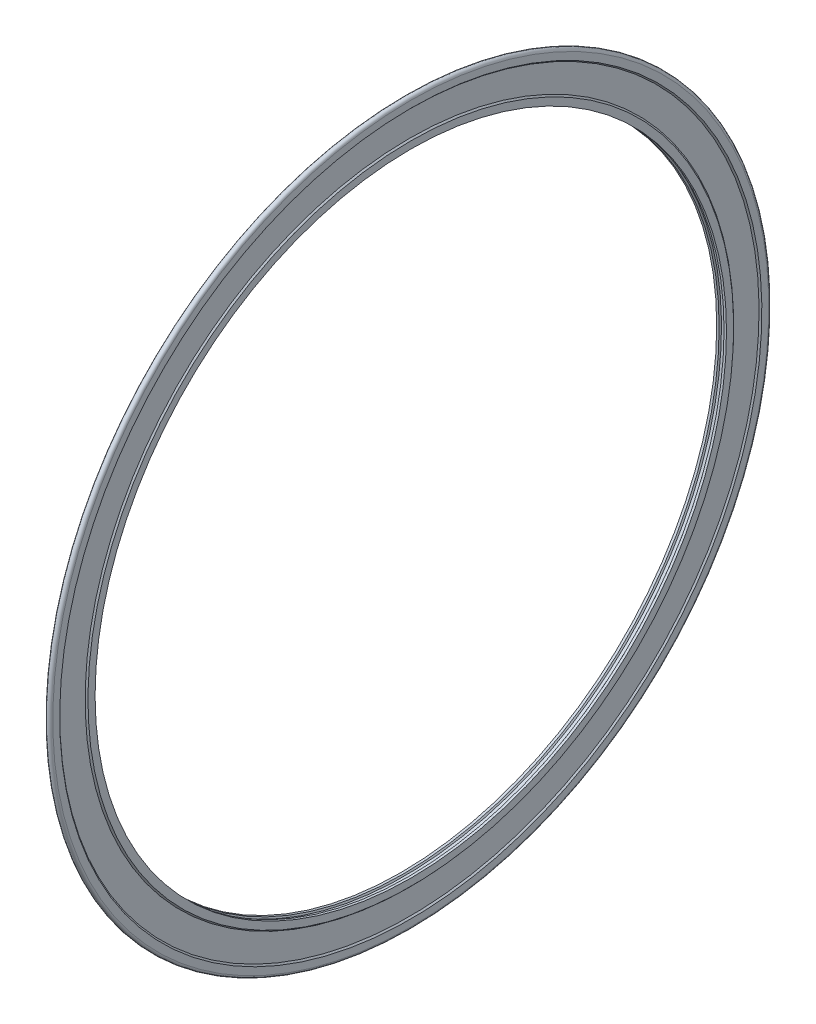
ISO-10303-21;
HEADER;
FILE_DESCRIPTION(('STEP AP214'),'2;1');
FILE_NAME('part.step','',(''),(''),'','','');
FILE_SCHEMA(('AUTOMOTIVE_DESIGN { 1 0 10303 214 1 1 1 1 }'));
ENDSEC;
DATA;
#1=APPLICATION_CONTEXT('core data for automotive mechanical design processes');
#2=APPLICATION_PROTOCOL_DEFINITION('international standard','automotive_design',2000,#1);
#3=PRODUCT_CONTEXT('',#1,'mechanical');
#4=PRODUCT('Part','Part','',(#3));
#5=PRODUCT_RELATED_PRODUCT_CATEGORY('part','',(#4));
#6=PRODUCT_DEFINITION_FORMATION('','',#4);
#7=PRODUCT_DEFINITION_CONTEXT('part definition',#1,'design');
#8=PRODUCT_DEFINITION('design','',#6,#7);
#9=PRODUCT_DEFINITION_SHAPE('','',#8);
#10=(LENGTH_UNIT() NAMED_UNIT(*) SI_UNIT(.MILLI.,.METRE.));
#11=(NAMED_UNIT(*) PLANE_ANGLE_UNIT() SI_UNIT($,.RADIAN.));
#12=(NAMED_UNIT(*) SI_UNIT($,.STERADIAN.) SOLID_ANGLE_UNIT());
#13=UNCERTAINTY_MEASURE_WITH_UNIT(LENGTH_MEASURE(1.E-05),#10,'distance_accuracy_value','');
#14=(GEOMETRIC_REPRESENTATION_CONTEXT(3) GLOBAL_UNCERTAINTY_ASSIGNED_CONTEXT((#13)) GLOBAL_UNIT_ASSIGNED_CONTEXT((#10,
#11,#12)) REPRESENTATION_CONTEXT('',''));
#15=CARTESIAN_POINT('',(0.,0.,0.));
#16=DIRECTION('',(0.,0.,1.));
#17=DIRECTION('',(1.,0.,0.));
#18=AXIS2_PLACEMENT_3D('',#15,#16,#17);
#19=CARTESIAN_POINT('',(15.7,0.,0.));
#20=DIRECTION('',(1.,0.,0.));
#21=DIRECTION('',(0.,1.,0.));
#22=AXIS2_PLACEMENT_3D('',#19,#20,#21);
#23=CONICAL_SURFACE('',#22,50.0591,0.785398163397455);
#24=CARTESIAN_POINT('',(15.6,0.,0.));
#25=DIRECTION('',(-1.,0.,0.));
#26=DIRECTION('',(0.,1.,0.));
#27=AXIS2_PLACEMENT_3D('',#24,#25,#26);
#28=CIRCLE('',#27,49.9591);
#29=CARTESIAN_POINT('',(15.6,49.9591,0.));
#30=VERTEX_POINT('',#29);
#31=EDGE_CURVE('E11',#30,#30,#28,.T.);
#32=ORIENTED_EDGE('',*,*,#31,.T.);
#33=EDGE_LOOP('',(#32));
#34=FACE_BOUND('',#33,.T.);
#35=CARTESIAN_POINT('',(15.8,0.,0.));
#36=DIRECTION('',(-1.,0.,0.));
#37=DIRECTION('',(0.,1.,0.));
#38=AXIS2_PLACEMENT_3D('',#35,#36,#37);
#39=CIRCLE('',#38,50.1591);
#40=CARTESIAN_POINT('',(15.8,50.1591,0.));
#41=VERTEX_POINT('',#40);
#42=EDGE_CURVE('E88',#41,#41,#39,.T.);
#43=ORIENTED_EDGE('',*,*,#42,.F.);
#44=EDGE_LOOP('',(#43));
#45=FACE_BOUND('',#44,.T.);
#46=ADVANCED_FACE('F16',(#34,#45),#23,.F.);
#47=CARTESIAN_POINT('',(15.6,48.1441,0.));
#48=DIRECTION('',(1.,0.,0.));
#49=DIRECTION('',(0.,-1.,0.));
#50=AXIS2_PLACEMENT_3D('',#47,#48,#49);
#51=PLANE('',#50);
#52=CARTESIAN_POINT('',(15.6,0.,0.));
#53=DIRECTION('',(-1.,0.,0.));
#54=DIRECTION('',(0.,1.,0.));
#55=AXIS2_PLACEMENT_3D('',#52,#53,#54);
#56=CIRCLE('',#55,46.3291);
#57=CARTESIAN_POINT('',(15.6,46.3291,0.));
#58=VERTEX_POINT('',#57);
#59=EDGE_CURVE('E26',#58,#58,#56,.T.);
#60=ORIENTED_EDGE('',*,*,#59,.T.);
#61=EDGE_LOOP('',(#60));
#62=FACE_BOUND('',#61,.T.);
#63=ORIENTED_EDGE('',*,*,#31,.F.);
#64=EDGE_LOOP('',(#63));
#65=FACE_BOUND('',#64,.T.);
#66=ADVANCED_FACE('F107',(#62,#65),#51,.T.);
#67=CARTESIAN_POINT('',(15.7,0.,0.));
#68=DIRECTION('',(-1.,0.,0.));
#69=DIRECTION('',(0.,1.,0.));
#70=AXIS2_PLACEMENT_3D('',#67,#68,#69);
#71=CONICAL_SURFACE('',#70,46.2291,0.785398163397455);
#72=CARTESIAN_POINT('',(15.8,0.,0.));
#73=DIRECTION('',(-1.,0.,0.));
#74=DIRECTION('',(0.,1.,0.));
#75=AXIS2_PLACEMENT_3D('',#72,#73,#74);
#76=CIRCLE('',#75,46.1291);
#77=CARTESIAN_POINT('',(15.8,46.1291,0.));
#78=VERTEX_POINT('',#77);
#79=EDGE_CURVE('E82',#78,#78,#76,.T.);
#80=ORIENTED_EDGE('',*,*,#79,.T.);
#81=EDGE_LOOP('',(#80));
#82=FACE_BOUND('',#81,.T.);
#83=ORIENTED_EDGE('',*,*,#59,.F.);
#84=EDGE_LOOP('',(#83));
#85=FACE_BOUND('',#84,.T.);
#86=ADVANCED_FACE('F110',(#82,#85),#71,.T.);
#87=CARTESIAN_POINT('',(15.8,45.61855,0.));
#88=DIRECTION('',(1.,0.,0.));
#89=DIRECTION('',(0.,-1.,0.));
#90=AXIS2_PLACEMENT_3D('',#87,#88,#89);
#91=PLANE('',#90);
#92=CARTESIAN_POINT('',(15.8,0.,0.));
#93=DIRECTION('',(-1.,0.,0.));
#94=DIRECTION('',(0.,1.,0.));
#95=AXIS2_PLACEMENT_3D('',#92,#93,#94);
#96=CIRCLE('',#95,45.108);
#97=CARTESIAN_POINT('',(15.8,45.108,0.));
#98=VERTEX_POINT('',#97);
#99=EDGE_CURVE('E73',#98,#98,#96,.T.);
#100=ORIENTED_EDGE('',*,*,#99,.T.);
#101=EDGE_LOOP('',(#100));
#102=FACE_BOUND('',#101,.T.);
#103=ORIENTED_EDGE('',*,*,#79,.F.);
#104=EDGE_LOOP('',(#103));
#105=FACE_BOUND('',#104,.T.);
#106=ADVANCED_FACE('F112',(#102,#105),#91,.T.);
#107=CARTESIAN_POINT('',(15.625,0.,0.));
#108=DIRECTION('',(1.,0.,0.));
#109=DIRECTION('',(0.,1.,0.));
#110=AXIS2_PLACEMENT_3D('',#107,#108,#109);
#111=CYLINDRICAL_SURFACE('',#110,45.108);
#112=CARTESIAN_POINT('',(15.45,0.,0.));
#113=DIRECTION('',(-1.,0.,0.));
#114=DIRECTION('',(0.,1.,0.));
#115=AXIS2_PLACEMENT_3D('',#112,#113,#114);
#116=CIRCLE('',#115,45.108);
#117=CARTESIAN_POINT('',(15.45,45.108,0.));
#118=VERTEX_POINT('',#117);
#119=EDGE_CURVE('E77',#118,#118,#116,.T.);
#120=ORIENTED_EDGE('',*,*,#119,.T.);
#121=EDGE_LOOP('',(#120));
#122=FACE_BOUND('',#121,.T.);
#123=ORIENTED_EDGE('',*,*,#99,.F.);
#124=EDGE_LOOP('',(#123));
#125=FACE_BOUND('',#124,.T.);
#126=ADVANCED_FACE('F18',(#122,#125),#111,.F.);
#127=CARTESIAN_POINT('',(15.379979246179,0.,0.));
#128=DIRECTION('',(-1.,0.,0.));
#129=DIRECTION('',(0.,1.,0.));
#130=AXIS2_PLACEMENT_3D('',#127,#128,#129);
#131=CONICAL_SURFACE('',#130,45.208,0.959931088596883);
#132=CARTESIAN_POINT('',(15.309958492358,0.,0.));
#133=DIRECTION('',(-1.,0.,0.));
#134=DIRECTION('',(0.,1.,0.));
#135=AXIS2_PLACEMENT_3D('',#132,#133,#134);
#136=CIRCLE('',#135,45.308);
#137=CARTESIAN_POINT('',(15.309958492358,45.308,0.));
#138=VERTEX_POINT('',#137);
#139=EDGE_CURVE('E80',#138,#138,#136,.T.);
#140=ORIENTED_EDGE('',*,*,#139,.T.);
#141=EDGE_LOOP('',(#140));
#142=FACE_BOUND('',#141,.T.);
#143=ORIENTED_EDGE('',*,*,#119,.F.);
#144=EDGE_LOOP('',(#143));
#145=FACE_BOUND('',#144,.T.);
#146=ADVANCED_FACE('F154',(#142,#145),#131,.F.);
#147=CARTESIAN_POINT('',(15.1,0.,0.));
#148=DIRECTION('',(1.,0.,0.));
#149=DIRECTION('',(0.,1.,0.));
#150=AXIS2_PLACEMENT_3D('',#147,#148,#149);
#151=CYLINDRICAL_SURFACE('',#150,45.308);
#152=CARTESIAN_POINT('',(14.8900415076419,0.,0.));
#153=DIRECTION('',(-1.,0.,0.));
#154=DIRECTION('',(0.,1.,0.));
#155=AXIS2_PLACEMENT_3D('',#152,#153,#154);
#156=CIRCLE('',#155,45.308);
#157=CARTESIAN_POINT('',(14.8900415076419,45.308,0.));
#158=VERTEX_POINT('',#157);
#159=EDGE_CURVE('E84',#158,#158,#156,.T.);
#160=ORIENTED_EDGE('',*,*,#159,.T.);
#161=EDGE_LOOP('',(#160));
#162=FACE_BOUND('',#161,.T.);
#163=ORIENTED_EDGE('',*,*,#139,.F.);
#164=EDGE_LOOP('',(#163));
#165=FACE_BOUND('',#164,.T.);
#166=ADVANCED_FACE('F152',(#162,#165),#151,.F.);
#167=CARTESIAN_POINT('',(14.820020753821,0.,0.));
#168=DIRECTION('',(1.,0.,0.));
#169=DIRECTION('',(0.,1.,0.));
#170=AXIS2_PLACEMENT_3D('',#167,#168,#169);
#171=CONICAL_SURFACE('',#170,45.208,0.959931088596892);
#172=CARTESIAN_POINT('',(14.75,0.,0.));
#173=DIRECTION('',(-1.,0.,0.));
#174=DIRECTION('',(0.,1.,0.));
#175=AXIS2_PLACEMENT_3D('',#172,#173,#174);
#176=CIRCLE('',#175,45.108);
#177=CARTESIAN_POINT('',(14.75,45.108,0.));
#178=VERTEX_POINT('',#177);
#179=EDGE_CURVE('E20',#178,#178,#176,.T.);
#180=ORIENTED_EDGE('',*,*,#179,.T.);
#181=EDGE_LOOP('',(#180));
#182=FACE_BOUND('',#181,.T.);
#183=ORIENTED_EDGE('',*,*,#159,.F.);
#184=EDGE_LOOP('',(#183));
#185=FACE_BOUND('',#184,.T.);
#186=ADVANCED_FACE('F135',(#182,#185),#171,.F.);
#187=CARTESIAN_POINT('',(14.575,0.,0.));
#188=DIRECTION('',(1.,0.,0.));
#189=DIRECTION('',(0.,1.,0.));
#190=AXIS2_PLACEMENT_3D('',#187,#188,#189);
#191=CYLINDRICAL_SURFACE('',#190,45.108);
#192=CARTESIAN_POINT('',(14.4,0.,0.));
#193=DIRECTION('',(-1.,0.,0.));
#194=DIRECTION('',(0.,1.,0.));
#195=AXIS2_PLACEMENT_3D('',#192,#193,#194);
#196=CIRCLE('',#195,45.108);
#197=CARTESIAN_POINT('',(14.4,45.108,0.));
#198=VERTEX_POINT('',#197);
#199=EDGE_CURVE('E92',#198,#198,#196,.T.);
#200=ORIENTED_EDGE('',*,*,#199,.T.);
#201=EDGE_LOOP('',(#200));
#202=FACE_BOUND('',#201,.T.);
#203=ORIENTED_EDGE('',*,*,#179,.F.);
#204=EDGE_LOOP('',(#203));
#205=FACE_BOUND('',#204,.T.);
#206=ADVANCED_FACE('F132',(#202,#205),#191,.F.);
#207=CARTESIAN_POINT('',(14.625,0.,0.));
#208=DIRECTION('',(1.,0.,0.));
#209=DIRECTION('',(0.,1.,0.));
#210=AXIS2_PLACEMENT_3D('',#207,#208,#209);
#211=CONICAL_SURFACE('',#210,45.7261824193773,1.22173047639603);
#212=CARTESIAN_POINT('',(14.85,0.,0.));
#213=DIRECTION('',(-1.,0.,0.));
#214=DIRECTION('',(0.,1.,0.));
#215=AXIS2_PLACEMENT_3D('',#212,#213,#214);
#216=CIRCLE('',#215,46.3443648387546);
#217=CARTESIAN_POINT('',(14.85,46.3443648387546,0.));
#218=VERTEX_POINT('',#217);
#219=EDGE_CURVE('E91',#218,#218,#216,.T.);
#220=ORIENTED_EDGE('',*,*,#219,.T.);
#221=EDGE_LOOP('',(#220));
#222=FACE_BOUND('',#221,.T.);
#223=ORIENTED_EDGE('',*,*,#199,.F.);
#224=EDGE_LOOP('',(#223));
#225=FACE_BOUND('',#224,.T.);
#226=ADVANCED_FACE('F134',(#222,#225),#211,.T.);
#227=CARTESIAN_POINT('',(14.85,48.3398840156111,0.));
#228=DIRECTION('',(-1.,0.,0.));
#229=DIRECTION('',(0.,1.,0.));
#230=AXIS2_PLACEMENT_3D('',#227,#228,#229);
#231=PLANE('',#230);
#232=CARTESIAN_POINT('',(14.85,0.,0.));
#233=DIRECTION('',(-1.,0.,0.));
#234=DIRECTION('',(0.,1.,0.));
#235=AXIS2_PLACEMENT_3D('',#232,#233,#234);
#236=CIRCLE('',#235,50.3354031924677);
#237=CARTESIAN_POINT('',(14.85,50.3354031924677,0.));
#238=VERTEX_POINT('',#237);
#239=EDGE_CURVE('E62',#238,#238,#236,.T.);
#240=ORIENTED_EDGE('',*,*,#239,.T.);
#241=EDGE_LOOP('',(#240));
#242=FACE_BOUND('',#241,.T.);
#243=ORIENTED_EDGE('',*,*,#219,.F.);
#244=EDGE_LOOP('',(#243));
#245=FACE_BOUND('',#244,.T.);
#246=ADVANCED_FACE('F139',(#242,#245),#231,.T.);
#247=CARTESIAN_POINT('',(14.9280384493976,0.,0.));
#248=DIRECTION('',(1.,0.,0.));
#249=DIRECTION('',(0.,1.,0.));
#250=AXIS2_PLACEMENT_3D('',#247,#248,#249);
#251=CONICAL_SURFACE('',#250,50.7779812317672,1.39626340159546);
#252=CARTESIAN_POINT('',(15.0060768987951,0.,0.));
#253=DIRECTION('',(-1.,0.,0.));
#254=DIRECTION('',(0.,1.,0.));
#255=AXIS2_PLACEMENT_3D('',#252,#253,#254);
#256=CIRCLE('',#255,51.2205592710668);
#257=CARTESIAN_POINT('',(15.0060768987951,51.2205592710668,0.));
#258=VERTEX_POINT('',#257);
#259=EDGE_CURVE('E57',#258,#258,#256,.T.);
#260=ORIENTED_EDGE('',*,*,#259,.T.);
#261=EDGE_LOOP('',(#260));
#262=FACE_BOUND('',#261,.T.);
#263=ORIENTED_EDGE('',*,*,#239,.F.);
#264=EDGE_LOOP('',(#263));
#265=FACE_BOUND('',#264,.T.);
#266=ADVANCED_FACE('F136',(#262,#265),#251,.T.);
#267=CARTESIAN_POINT('',(15.4,0.,0.));
#268=DIRECTION('',(-1.,0.,0.));
#269=DIRECTION('',(0.,0.,1.));
#270=AXIS2_PLACEMENT_3D('',#267,#268,#269);
#271=TOROIDAL_SURFACE('',#270,51.1511,0.4);
#272=CARTESIAN_POINT('',(15.8,0.,0.));
#273=DIRECTION('',(-1.,0.,0.));
#274=DIRECTION('',(0.,1.,0.));
#275=AXIS2_PLACEMENT_3D('',#272,#273,#274);
#276=CIRCLE('',#275,51.1511);
#277=CARTESIAN_POINT('',(15.8,51.1511,0.));
#278=VERTEX_POINT('',#277);
#279=EDGE_CURVE('E86',#278,#278,#276,.T.);
#280=ORIENTED_EDGE('',*,*,#279,.T.);
#281=EDGE_LOOP('',(#280));
#282=FACE_BOUND('',#281,.T.);
#283=ORIENTED_EDGE('',*,*,#259,.F.);
#284=EDGE_LOOP('',(#283));
#285=FACE_BOUND('',#284,.T.);
#286=ADVANCED_FACE('F138',(#282,#285),#271,.T.);
#287=CARTESIAN_POINT('',(15.8,50.6551,0.));
#288=DIRECTION('',(1.,0.,0.));
#289=DIRECTION('',(0.,-1.,0.));
#290=AXIS2_PLACEMENT_3D('',#287,#288,#289);
#291=PLANE('',#290);
#292=ORIENTED_EDGE('',*,*,#42,.T.);
#293=EDGE_LOOP('',(#292));
#294=FACE_BOUND('',#293,.T.);
#295=ORIENTED_EDGE('',*,*,#279,.F.);
#296=EDGE_LOOP('',(#295));
#297=FACE_BOUND('',#296,.T.);
#298=ADVANCED_FACE('F130',(#294,#297),#291,.T.);
#299=CLOSED_SHELL('',(#46,#66,#86,#106,#126,#146,#166,#186,#206,#226,#246,#266,#286,#298));
#300=MANIFOLD_SOLID_BREP('B1',#299);
#301=ADVANCED_BREP_SHAPE_REPRESENTATION('',(#18,#300),#14);
#302=SHAPE_DEFINITION_REPRESENTATION(#9,#301);
ENDSEC;
END-ISO-10303-21;
